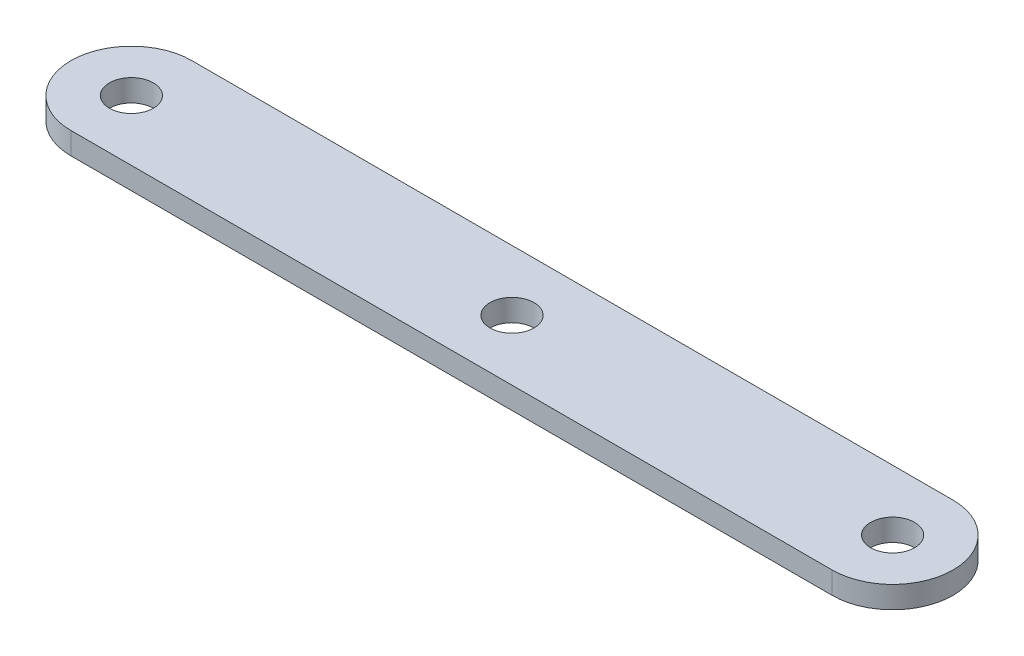
ISO-10303-21;
HEADER;
FILE_DESCRIPTION(('STEP AP214'),'2;1');
FILE_NAME('part.step','',(''),(''),'','','');
FILE_SCHEMA(('AUTOMOTIVE_DESIGN { 1 0 10303 214 1 1 1 1 }'));
ENDSEC;
DATA;
#1=APPLICATION_CONTEXT('core data for automotive mechanical design processes');
#2=APPLICATION_PROTOCOL_DEFINITION('international standard','automotive_design',2000,#1);
#3=PRODUCT_CONTEXT('',#1,'mechanical');
#4=PRODUCT('Part','Part','',(#3));
#5=PRODUCT_RELATED_PRODUCT_CATEGORY('part','',(#4));
#6=PRODUCT_DEFINITION_FORMATION('','',#4);
#7=PRODUCT_DEFINITION_CONTEXT('part definition',#1,'design');
#8=PRODUCT_DEFINITION('design','',#6,#7);
#9=PRODUCT_DEFINITION_SHAPE('','',#8);
#10=(LENGTH_UNIT() NAMED_UNIT(*) SI_UNIT(.MILLI.,.METRE.));
#11=(NAMED_UNIT(*) PLANE_ANGLE_UNIT() SI_UNIT($,.RADIAN.));
#12=(NAMED_UNIT(*) SI_UNIT($,.STERADIAN.) SOLID_ANGLE_UNIT());
#13=UNCERTAINTY_MEASURE_WITH_UNIT(LENGTH_MEASURE(1.E-05),#10,'distance_accuracy_value','');
#14=(GEOMETRIC_REPRESENTATION_CONTEXT(3) GLOBAL_UNCERTAINTY_ASSIGNED_CONTEXT((#13)) GLOBAL_UNIT_ASSIGNED_CONTEXT((#10,
#11,#12)) REPRESENTATION_CONTEXT('',''));
#15=CARTESIAN_POINT('',(0.,0.,0.));
#16=DIRECTION('',(0.,0.,1.));
#17=DIRECTION('',(1.,0.,0.));
#18=AXIS2_PLACEMENT_3D('',#15,#16,#17);
#19=CARTESIAN_POINT('',(-34.61,2.,0.));
#20=DIRECTION('',(0.,1.,0.));
#21=DIRECTION('',(0.,0.,1.));
#22=AXIS2_PLACEMENT_3D('',#19,#20,#21);
#23=PLANE('',#22);
#24=CARTESIAN_POINT('',(34.61,2.,0.));
#25=DIRECTION('',(0.,1.,0.));
#26=DIRECTION('',(0.,0.,1.));
#27=AXIS2_PLACEMENT_3D('',#24,#25,#26);
#28=CIRCLE('',#27,2.);
#29=CARTESIAN_POINT('',(34.61,2.,1.99999999999999));
#30=VERTEX_POINT('',#29);
#31=EDGE_CURVE('E138',#30,#30,#28,.T.);
#32=ORIENTED_EDGE('',*,*,#31,.F.);
#33=EDGE_LOOP('',(#32));
#34=FACE_BOUND('',#33,.T.);
#35=CARTESIAN_POINT('',(-34.61,2.,0.));
#36=DIRECTION('',(0.,1.,0.));
#37=DIRECTION('',(0.,0.,1.));
#38=AXIS2_PLACEMENT_3D('',#35,#36,#37);
#39=CIRCLE('',#38,5.5);
#40=CARTESIAN_POINT('',(-34.61,2.,-5.5));
#41=VERTEX_POINT('',#40);
#42=CARTESIAN_POINT('',(-34.61,2.,5.5));
#43=VERTEX_POINT('',#42);
#44=EDGE_CURVE('E96',#41,#43,#39,.T.);
#45=ORIENTED_EDGE('',*,*,#44,.T.);
#46=DIRECTION('',(1.,0.,0.));
#47=VECTOR('',#46,1.);
#48=CARTESIAN_POINT('',(-34.61,2.,5.5));
#49=LINE('',#48,#47);
#50=CARTESIAN_POINT('',(34.61,2.,5.49999999999998));
#51=VERTEX_POINT('',#50);
#52=EDGE_CURVE('E91',#43,#51,#49,.T.);
#53=ORIENTED_EDGE('',*,*,#52,.T.);
#54=CARTESIAN_POINT('',(34.61,2.,0.));
#55=DIRECTION('',(0.,1.,0.));
#56=DIRECTION('',(0.,0.,1.));
#57=AXIS2_PLACEMENT_3D('',#54,#55,#56);
#58=CIRCLE('',#57,5.5);
#59=CARTESIAN_POINT('',(34.61,2.,-5.50000000000001));
#60=VERTEX_POINT('',#59);
#61=EDGE_CURVE('E94',#51,#60,#58,.T.);
#62=ORIENTED_EDGE('',*,*,#61,.T.);
#63=DIRECTION('',(-1.,0.,0.));
#64=VECTOR('',#63,1.);
#65=CARTESIAN_POINT('',(-34.61,2.,-5.5));
#66=LINE('',#65,#64);
#67=EDGE_CURVE('E61',#60,#41,#66,.T.);
#68=ORIENTED_EDGE('',*,*,#67,.T.);
#69=EDGE_LOOP('',(#45,#53,#62,#68));
#70=FACE_BOUND('',#69,.T.);
#71=CARTESIAN_POINT('',(-34.61,2.,0.));
#72=DIRECTION('',(0.,1.,0.));
#73=DIRECTION('',(0.,0.,1.));
#74=AXIS2_PLACEMENT_3D('',#71,#72,#73);
#75=CIRCLE('',#74,2.);
#76=CARTESIAN_POINT('',(-34.61,2.,2.));
#77=VERTEX_POINT('',#76);
#78=EDGE_CURVE('E116',#77,#77,#75,.T.);
#79=ORIENTED_EDGE('',*,*,#78,.F.);
#80=EDGE_LOOP('',(#79));
#81=FACE_BOUND('',#80,.T.);
#82=CARTESIAN_POINT('',(0.,2.,0.));
#83=DIRECTION('',(0.,1.,0.));
#84=DIRECTION('',(0.,0.,1.));
#85=AXIS2_PLACEMENT_3D('',#82,#83,#84);
#86=CIRCLE('',#85,2.);
#87=CARTESIAN_POINT('',(0.,2.,1.99999999999999));
#88=VERTEX_POINT('',#87);
#89=EDGE_CURVE('E146',#88,#88,#86,.T.);
#90=ORIENTED_EDGE('',*,*,#89,.F.);
#91=EDGE_LOOP('',(#90));
#92=FACE_BOUND('',#91,.T.);
#93=ADVANCED_FACE('F43',(#34,#70,#81,#92),#23,.T.);
#94=CARTESIAN_POINT('',(-34.61,0.,0.));
#95=DIRECTION('',(0.,1.,0.));
#96=DIRECTION('',(0.,0.,1.));
#97=AXIS2_PLACEMENT_3D('',#94,#95,#96);
#98=PLANE('',#97);
#99=CARTESIAN_POINT('',(-34.61,0.,0.));
#100=DIRECTION('',(0.,1.,0.));
#101=DIRECTION('',(0.,0.,1.));
#102=AXIS2_PLACEMENT_3D('',#99,#100,#101);
#103=CIRCLE('',#102,5.5);
#104=CARTESIAN_POINT('',(-34.61,0.,-5.5));
#105=VERTEX_POINT('',#104);
#106=CARTESIAN_POINT('',(-34.61,0.,5.5));
#107=VERTEX_POINT('',#106);
#108=EDGE_CURVE('E112',#105,#107,#103,.T.);
#109=ORIENTED_EDGE('',*,*,#108,.F.);
#110=DIRECTION('',(-1.,0.,0.));
#111=VECTOR('',#110,1.);
#112=CARTESIAN_POINT('',(-34.61,0.,-5.5));
#113=LINE('',#112,#111);
#114=CARTESIAN_POINT('',(34.61,0.,-5.50000000000001));
#115=VERTEX_POINT('',#114);
#116=EDGE_CURVE('E84',#115,#105,#113,.T.);
#117=ORIENTED_EDGE('',*,*,#116,.F.);
#118=CARTESIAN_POINT('',(34.61,0.,0.));
#119=DIRECTION('',(0.,1.,0.));
#120=DIRECTION('',(0.,0.,1.));
#121=AXIS2_PLACEMENT_3D('',#118,#119,#120);
#122=CIRCLE('',#121,5.5);
#123=CARTESIAN_POINT('',(34.61,0.,5.49999999999998));
#124=VERTEX_POINT('',#123);
#125=EDGE_CURVE('E78',#124,#115,#122,.T.);
#126=ORIENTED_EDGE('',*,*,#125,.F.);
#127=DIRECTION('',(1.,0.,0.));
#128=VECTOR('',#127,1.);
#129=CARTESIAN_POINT('',(-34.61,0.,5.5));
#130=LINE('',#129,#128);
#131=EDGE_CURVE('E101',#107,#124,#130,.T.);
#132=ORIENTED_EDGE('',*,*,#131,.F.);
#133=EDGE_LOOP('',(#109,#117,#126,#132));
#134=FACE_BOUND('',#133,.T.);
#135=CARTESIAN_POINT('',(-34.61,0.,0.));
#136=DIRECTION('',(0.,1.,0.));
#137=DIRECTION('',(0.,0.,1.));
#138=AXIS2_PLACEMENT_3D('',#135,#136,#137);
#139=CIRCLE('',#138,2.);
#140=CARTESIAN_POINT('',(-34.61,0.,2.));
#141=VERTEX_POINT('',#140);
#142=EDGE_CURVE('E134',#141,#141,#139,.T.);
#143=ORIENTED_EDGE('',*,*,#142,.T.);
#144=EDGE_LOOP('',(#143));
#145=FACE_BOUND('',#144,.T.);
#146=CARTESIAN_POINT('',(34.61,0.,0.));
#147=DIRECTION('',(0.,1.,0.));
#148=DIRECTION('',(0.,0.,1.));
#149=AXIS2_PLACEMENT_3D('',#146,#147,#148);
#150=CIRCLE('',#149,2.);
#151=CARTESIAN_POINT('',(34.61,0.,1.99999999999999));
#152=VERTEX_POINT('',#151);
#153=EDGE_CURVE('E142',#152,#152,#150,.T.);
#154=ORIENTED_EDGE('',*,*,#153,.T.);
#155=EDGE_LOOP('',(#154));
#156=FACE_BOUND('',#155,.T.);
#157=CARTESIAN_POINT('',(0.,0.,0.));
#158=DIRECTION('',(0.,1.,0.));
#159=DIRECTION('',(0.,0.,1.));
#160=AXIS2_PLACEMENT_3D('',#157,#158,#159);
#161=CIRCLE('',#160,2.);
#162=CARTESIAN_POINT('',(0.,0.,1.99999999999999));
#163=VERTEX_POINT('',#162);
#164=EDGE_CURVE('E150',#163,#163,#161,.T.);
#165=ORIENTED_EDGE('',*,*,#164,.T.);
#166=EDGE_LOOP('',(#165));
#167=FACE_BOUND('',#166,.T.);
#168=ADVANCED_FACE('F129',(#134,#145,#156,#167),#98,.F.);
#169=CARTESIAN_POINT('',(-34.61,2.,0.));
#170=DIRECTION('',(0.,-1.,0.));
#171=DIRECTION('',(0.,0.,-1.));
#172=AXIS2_PLACEMENT_3D('',#169,#170,#171);
#173=CYLINDRICAL_SURFACE('',#172,5.5);
#174=ORIENTED_EDGE('',*,*,#108,.T.);
#175=DIRECTION('',(0.,-1.,0.));
#176=VECTOR('',#175,1.);
#177=CARTESIAN_POINT('',(-34.61,2.,5.5));
#178=LINE('',#177,#176);
#179=EDGE_CURVE('E11',#43,#107,#178,.T.);
#180=ORIENTED_EDGE('',*,*,#179,.F.);
#181=ORIENTED_EDGE('',*,*,#44,.F.);
#182=DIRECTION('',(0.,-1.,0.));
#183=VECTOR('',#182,1.);
#184=CARTESIAN_POINT('',(-34.61,2.,-5.5));
#185=LINE('',#184,#183);
#186=EDGE_CURVE('E108',#41,#105,#185,.T.);
#187=ORIENTED_EDGE('',*,*,#186,.T.);
#188=EDGE_LOOP('',(#174,#180,#181,#187));
#189=FACE_BOUND('',#188,.T.);
#190=ADVANCED_FACE('F45',(#189),#173,.T.);
#191=CARTESIAN_POINT('',(-34.61,2.,5.5));
#192=DIRECTION('',(0.,0.,-1.));
#193=DIRECTION('',(-1.,0.,0.));
#194=AXIS2_PLACEMENT_3D('',#191,#192,#193);
#195=PLANE('',#194);
#196=ORIENTED_EDGE('',*,*,#131,.T.);
#197=DIRECTION('',(0.,-1.,0.));
#198=VECTOR('',#197,1.);
#199=CARTESIAN_POINT('',(34.61,2.,5.49999999999998));
#200=LINE('',#199,#198);
#201=EDGE_CURVE('E53',#51,#124,#200,.T.);
#202=ORIENTED_EDGE('',*,*,#201,.F.);
#203=ORIENTED_EDGE('',*,*,#52,.F.);
#204=ORIENTED_EDGE('',*,*,#179,.T.);
#205=EDGE_LOOP('',(#196,#202,#203,#204));
#206=FACE_BOUND('',#205,.T.);
#207=ADVANCED_FACE('F100',(#206),#195,.F.);
#208=CARTESIAN_POINT('',(34.61,2.,0.));
#209=DIRECTION('',(0.,-1.,0.));
#210=DIRECTION('',(0.,0.,-1.));
#211=AXIS2_PLACEMENT_3D('',#208,#209,#210);
#212=CYLINDRICAL_SURFACE('',#211,5.5);
#213=ORIENTED_EDGE('',*,*,#125,.T.);
#214=DIRECTION('',(0.,-1.,0.));
#215=VECTOR('',#214,1.);
#216=CARTESIAN_POINT('',(34.61,2.,-5.50000000000001));
#217=LINE('',#216,#215);
#218=EDGE_CURVE('E103',#60,#115,#217,.T.);
#219=ORIENTED_EDGE('',*,*,#218,.F.);
#220=ORIENTED_EDGE('',*,*,#61,.F.);
#221=ORIENTED_EDGE('',*,*,#201,.T.);
#222=EDGE_LOOP('',(#213,#219,#220,#221));
#223=FACE_BOUND('',#222,.T.);
#224=ADVANCED_FACE('F104',(#223),#212,.T.);
#225=CARTESIAN_POINT('',(-34.61,2.,-5.5));
#226=DIRECTION('',(0.,0.,1.));
#227=DIRECTION('',(1.,0.,0.));
#228=AXIS2_PLACEMENT_3D('',#225,#226,#227);
#229=PLANE('',#228);
#230=ORIENTED_EDGE('',*,*,#116,.T.);
#231=ORIENTED_EDGE('',*,*,#186,.F.);
#232=ORIENTED_EDGE('',*,*,#67,.F.);
#233=ORIENTED_EDGE('',*,*,#218,.T.);
#234=EDGE_LOOP('',(#230,#231,#232,#233));
#235=FACE_BOUND('',#234,.T.);
#236=ADVANCED_FACE('F126',(#235),#229,.F.);
#237=CARTESIAN_POINT('',(-34.61,2.,0.));
#238=DIRECTION('',(0.,-1.,0.));
#239=DIRECTION('',(0.,0.,-1.));
#240=AXIS2_PLACEMENT_3D('',#237,#238,#239);
#241=CYLINDRICAL_SURFACE('',#240,2.);
#242=ORIENTED_EDGE('',*,*,#78,.T.);
#243=EDGE_LOOP('',(#242));
#244=FACE_BOUND('',#243,.T.);
#245=ORIENTED_EDGE('',*,*,#142,.F.);
#246=EDGE_LOOP('',(#245));
#247=FACE_BOUND('',#246,.T.);
#248=ADVANCED_FACE('F170',(#244,#247),#241,.F.);
#249=CARTESIAN_POINT('',(34.61,2.,0.));
#250=DIRECTION('',(0.,-1.,0.));
#251=DIRECTION('',(0.,0.,-1.));
#252=AXIS2_PLACEMENT_3D('',#249,#250,#251);
#253=CYLINDRICAL_SURFACE('',#252,2.);
#254=ORIENTED_EDGE('',*,*,#31,.T.);
#255=EDGE_LOOP('',(#254));
#256=FACE_BOUND('',#255,.T.);
#257=ORIENTED_EDGE('',*,*,#153,.F.);
#258=EDGE_LOOP('',(#257));
#259=FACE_BOUND('',#258,.T.);
#260=ADVANCED_FACE('F224',(#256,#259),#253,.F.);
#261=CARTESIAN_POINT('',(0.,2.,0.));
#262=DIRECTION('',(0.,-1.,0.));
#263=DIRECTION('',(0.,0.,-1.));
#264=AXIS2_PLACEMENT_3D('',#261,#262,#263);
#265=CYLINDRICAL_SURFACE('',#264,2.);
#266=ORIENTED_EDGE('',*,*,#89,.T.);
#267=EDGE_LOOP('',(#266));
#268=FACE_BOUND('',#267,.T.);
#269=ORIENTED_EDGE('',*,*,#164,.F.);
#270=EDGE_LOOP('',(#269));
#271=FACE_BOUND('',#270,.T.);
#272=ADVANCED_FACE('F158',(#268,#271),#265,.F.);
#273=CLOSED_SHELL('',(#93,#168,#190,#207,#224,#236,#248,#260,#272));
#274=MANIFOLD_SOLID_BREP('B2',#273);
#275=ADVANCED_BREP_SHAPE_REPRESENTATION('',(#18,#274),#14);
#276=SHAPE_DEFINITION_REPRESENTATION(#9,#275);
ENDSEC;
END-ISO-10303-21;
